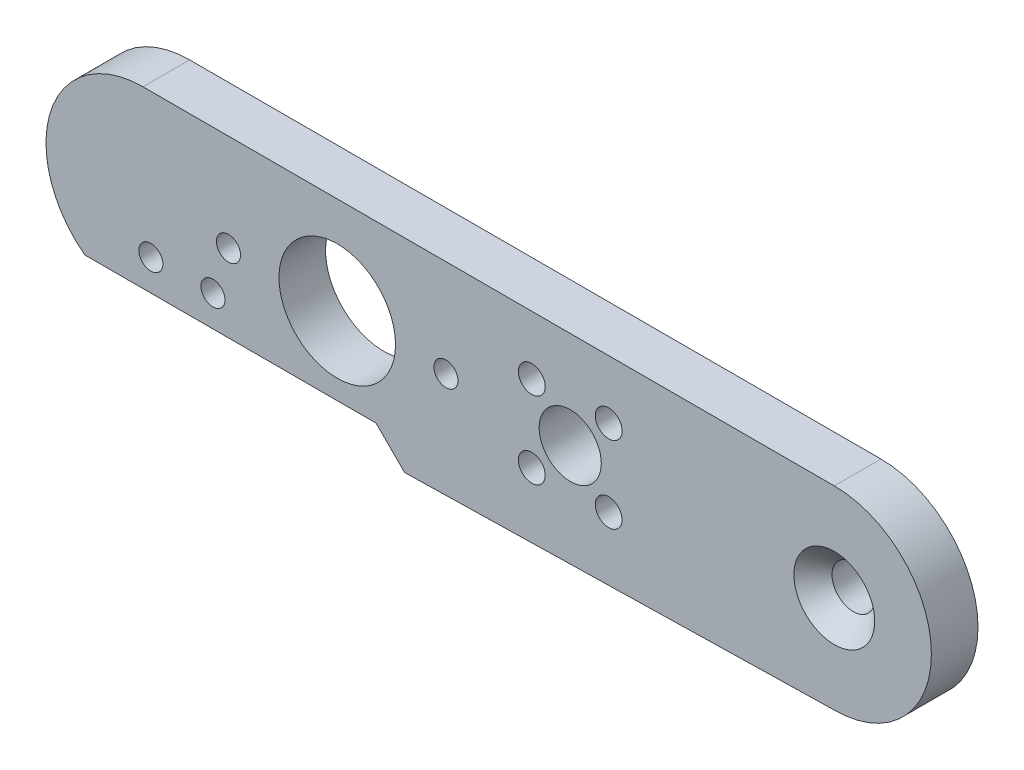
ISO-10303-21;
HEADER;
FILE_DESCRIPTION(('STEP AP214'),'2;1');
FILE_NAME('part.step','',(''),(''),'','','');
FILE_SCHEMA(('AUTOMOTIVE_DESIGN { 1 0 10303 214 1 1 1 1 }'));
ENDSEC;
DATA;
#1=APPLICATION_CONTEXT('core data for automotive mechanical design processes');
#2=APPLICATION_PROTOCOL_DEFINITION('international standard','automotive_design',2000,#1);
#3=PRODUCT_CONTEXT('',#1,'mechanical');
#4=PRODUCT('Part','Part','',(#3));
#5=PRODUCT_RELATED_PRODUCT_CATEGORY('part','',(#4));
#6=PRODUCT_DEFINITION_FORMATION('','',#4);
#7=PRODUCT_DEFINITION_CONTEXT('part definition',#1,'design');
#8=PRODUCT_DEFINITION('design','',#6,#7);
#9=PRODUCT_DEFINITION_SHAPE('','',#8);
#10=(LENGTH_UNIT() NAMED_UNIT(*) SI_UNIT(.MILLI.,.METRE.));
#11=(NAMED_UNIT(*) PLANE_ANGLE_UNIT() SI_UNIT($,.RADIAN.));
#12=(NAMED_UNIT(*) SI_UNIT($,.STERADIAN.) SOLID_ANGLE_UNIT());
#13=UNCERTAINTY_MEASURE_WITH_UNIT(LENGTH_MEASURE(1.E-05),#10,'distance_accuracy_value','');
#14=(GEOMETRIC_REPRESENTATION_CONTEXT(3) GLOBAL_UNCERTAINTY_ASSIGNED_CONTEXT((#13)) GLOBAL_UNIT_ASSIGNED_CONTEXT((#10,
#11,#12)) REPRESENTATION_CONTEXT('',''));
#15=CARTESIAN_POINT('',(0.,0.,0.));
#16=DIRECTION('',(0.,0.,1.));
#17=DIRECTION('',(1.,0.,0.));
#18=AXIS2_PLACEMENT_3D('',#15,#16,#17);
#19=CARTESIAN_POINT('',(-44.5,0.,6.));
#20=DIRECTION('',(0.,0.,1.));
#21=DIRECTION('',(1.,0.,0.));
#22=AXIS2_PLACEMENT_3D('',#19,#20,#21);
#23=PLANE('',#22);
#24=CARTESIAN_POINT('',(-43.5,-5.99999999999997,6.));
#25=DIRECTION('',(0.,0.,1.));
#26=DIRECTION('',(1.,0.,0.));
#27=AXIS2_PLACEMENT_3D('',#24,#25,#26);
#28=CIRCLE('',#27,1.55);
#29=CARTESIAN_POINT('',(-41.95,-5.99999999999997,6.));
#30=VERTEX_POINT('',#29);
#31=EDGE_CURVE('E251',#30,#30,#28,.T.);
#32=ORIENTED_EDGE('',*,*,#31,.F.);
#33=EDGE_LOOP('',(#32));
#34=FACE_BOUND('',#33,.T.);
#35=CARTESIAN_POINT('',(-35.5,-5.99999999999997,6.));
#36=DIRECTION('',(0.,0.,1.));
#37=DIRECTION('',(1.,0.,0.));
#38=AXIS2_PLACEMENT_3D('',#35,#36,#37);
#39=CIRCLE('',#38,1.55);
#40=CARTESIAN_POINT('',(-33.95,-5.99999999999997,6.));
#41=VERTEX_POINT('',#40);
#42=EDGE_CURVE('E255',#41,#41,#39,.T.);
#43=ORIENTED_EDGE('',*,*,#42,.F.);
#44=EDGE_LOOP('',(#43));
#45=FACE_BOUND('',#44,.T.);
#46=CARTESIAN_POINT('',(44.5,0.,6.));
#47=DIRECTION('',(0.,0.,1.));
#48=DIRECTION('',(1.,0.,0.));
#49=AXIS2_PLACEMENT_3D('',#46,#47,#48);
#50=CIRCLE('',#49,5.2);
#51=CARTESIAN_POINT('',(49.7,0.,6.));
#52=VERTEX_POINT('',#51);
#53=EDGE_CURVE('E261',#52,#52,#50,.T.);
#54=ORIENTED_EDGE('',*,*,#53,.F.);
#55=EDGE_LOOP('',(#54));
#56=FACE_BOUND('',#55,.T.);
#57=CARTESIAN_POINT('',(-5.5,0.,6.));
#58=DIRECTION('',(0.,0.,1.));
#59=DIRECTION('',(1.,0.,0.));
#60=AXIS2_PLACEMENT_3D('',#57,#58,#59);
#61=CIRCLE('',#60,1.55);
#62=CARTESIAN_POINT('',(-3.95,0.,6.));
#63=VERTEX_POINT('',#62);
#64=EDGE_CURVE('E277',#63,#63,#61,.T.);
#65=ORIENTED_EDGE('',*,*,#64,.F.);
#66=EDGE_LOOP('',(#65));
#67=FACE_BOUND('',#66,.T.);
#68=CARTESIAN_POINT('',(15.4497474683058,-4.94974746830584,6.));
#69=DIRECTION('',(0.,0.,1.));
#70=DIRECTION('',(-1.,0.,0.));
#71=AXIS2_PLACEMENT_3D('',#68,#69,#70);
#72=CIRCLE('',#71,1.72644884283377);
#73=CARTESIAN_POINT('',(13.723298625472,-4.94974746830584,6.));
#74=VERTEX_POINT('',#73);
#75=EDGE_CURVE('E289',#74,#74,#72,.T.);
#76=ORIENTED_EDGE('',*,*,#75,.F.);
#77=EDGE_LOOP('',(#76));
#78=FACE_BOUND('',#77,.T.);
#79=CARTESIAN_POINT('',(5.55025253169418,4.94974746830584,6.));
#80=DIRECTION('',(0.,0.,1.));
#81=DIRECTION('',(-1.,0.,0.));
#82=AXIS2_PLACEMENT_3D('',#79,#80,#81);
#83=CIRCLE('',#82,1.72644884283377);
#84=CARTESIAN_POINT('',(3.82380368886041,4.94974746830584,6.));
#85=VERTEX_POINT('',#84);
#86=EDGE_CURVE('E301',#85,#85,#83,.T.);
#87=ORIENTED_EDGE('',*,*,#86,.F.);
#88=EDGE_LOOP('',(#87));
#89=FACE_BOUND('',#88,.T.);
#90=CARTESIAN_POINT('',(10.5,0.,6.));
#91=DIRECTION('',(0.,0.,1.));
#92=DIRECTION('',(1.,0.,0.));
#93=AXIS2_PLACEMENT_3D('',#90,#91,#92);
#94=CIRCLE('',#93,4.);
#95=CARTESIAN_POINT('',(14.5,0.,6.));
#96=VERTEX_POINT('',#95);
#97=EDGE_CURVE('E121',#96,#96,#94,.T.);
#98=ORIENTED_EDGE('',*,*,#97,.F.);
#99=EDGE_LOOP('',(#98));
#100=FACE_BOUND('',#99,.T.);
#101=CARTESIAN_POINT('',(-44.5,0.,6.));
#102=DIRECTION('',(0.,0.,1.));
#103=DIRECTION('',(1.,0.,0.));
#104=AXIS2_PLACEMENT_3D('',#101,#102,#103);
#105=CIRCLE('',#104,12.5);
#106=CARTESIAN_POINT('',(-44.5,12.5,6.));
#107=VERTEX_POINT('',#106);
#108=CARTESIAN_POINT('',(-52.,-10.,6.));
#109=VERTEX_POINT('',#108);
#110=EDGE_CURVE('E128',#107,#109,#105,.T.);
#111=ORIENTED_EDGE('',*,*,#110,.T.);
#112=DIRECTION('',(1.,0.,0.));
#113=VECTOR('',#112,1.);
#114=CARTESIAN_POINT('',(-52.,-10.,6.));
#115=LINE('',#114,#113);
#116=CARTESIAN_POINT('',(-14.5,-10.,6.));
#117=VERTEX_POINT('',#116);
#118=EDGE_CURVE('E86',#109,#117,#115,.T.);
#119=ORIENTED_EDGE('',*,*,#118,.T.);
#120=DIRECTION('',(0.707106781186547,-0.707106781186549,0.));
#121=VECTOR('',#120,1.);
#122=CARTESIAN_POINT('',(-14.5,-10.,6.));
#123=LINE('',#122,#121);
#124=CARTESIAN_POINT('',(-10.829485488719,-13.670514511281,6.));
#125=VERTEX_POINT('',#124);
#126=EDGE_CURVE('E99',#117,#125,#123,.T.);
#127=ORIENTED_EDGE('',*,*,#126,.T.);
#128=DIRECTION('',(0.999776300713351,0.0211506154030379,0.));
#129=VECTOR('',#128,1.);
#130=CARTESIAN_POINT('',(-10.829485488719,-13.670514511281,6.));
#131=LINE('',#130,#129);
#132=CARTESIAN_POINT('',(44.5,-12.5,6.));
#133=VERTEX_POINT('',#132);
#134=EDGE_CURVE('E93',#125,#133,#131,.T.);
#135=ORIENTED_EDGE('',*,*,#134,.T.);
#136=CARTESIAN_POINT('',(44.5,0.,6.));
#137=DIRECTION('',(0.,0.,1.));
#138=DIRECTION('',(1.,0.,0.));
#139=AXIS2_PLACEMENT_3D('',#136,#137,#138);
#140=CIRCLE('',#139,12.5);
#141=CARTESIAN_POINT('',(44.5,12.5,6.));
#142=VERTEX_POINT('',#141);
#143=EDGE_CURVE('E97',#133,#142,#140,.T.);
#144=ORIENTED_EDGE('',*,*,#143,.T.);
#145=DIRECTION('',(-1.,0.,0.));
#146=VECTOR('',#145,1.);
#147=CARTESIAN_POINT('',(-44.5,12.5,6.));
#148=LINE('',#147,#146);
#149=EDGE_CURVE('E49',#142,#107,#148,.T.);
#150=ORIENTED_EDGE('',*,*,#149,.T.);
#151=EDGE_LOOP('',(#111,#119,#127,#135,#144,#150));
#152=FACE_BOUND('',#151,.T.);
#153=CARTESIAN_POINT('',(15.4497474683058,4.94974746830584,6.));
#154=DIRECTION('',(0.,0.,1.));
#155=DIRECTION('',(1.,0.,0.));
#156=AXIS2_PLACEMENT_3D('',#153,#154,#155);
#157=CIRCLE('',#156,1.72644884283376);
#158=CARTESIAN_POINT('',(17.1761963111396,4.94974746830584,6.));
#159=VERTEX_POINT('',#158);
#160=EDGE_CURVE('E307',#159,#159,#157,.T.);
#161=ORIENTED_EDGE('',*,*,#160,.F.);
#162=EDGE_LOOP('',(#161));
#163=FACE_BOUND('',#162,.T.);
#164=CARTESIAN_POINT('',(5.55025253169418,-4.94974746830584,6.));
#165=DIRECTION('',(0.,0.,1.));
#166=DIRECTION('',(1.,0.,0.));
#167=AXIS2_PLACEMENT_3D('',#164,#165,#166);
#168=CIRCLE('',#167,1.72644884283377);
#169=CARTESIAN_POINT('',(7.27670137452794,-4.94974746830584,6.));
#170=VERTEX_POINT('',#169);
#171=EDGE_CURVE('E295',#170,#170,#168,.T.);
#172=ORIENTED_EDGE('',*,*,#171,.F.);
#173=EDGE_LOOP('',(#172));
#174=FACE_BOUND('',#173,.T.);
#175=CARTESIAN_POINT('',(-19.5,0.,6.));
#176=DIRECTION('',(0.,0.,1.));
#177=DIRECTION('',(1.,0.,0.));
#178=AXIS2_PLACEMENT_3D('',#175,#176,#177);
#179=CIRCLE('',#178,7.5);
#180=CARTESIAN_POINT('',(-12.,0.,6.));
#181=VERTEX_POINT('',#180);
#182=EDGE_CURVE('E283',#181,#181,#179,.T.);
#183=ORIENTED_EDGE('',*,*,#182,.F.);
#184=EDGE_LOOP('',(#183));
#185=FACE_BOUND('',#184,.T.);
#186=CARTESIAN_POINT('',(-33.5,0.,6.));
#187=DIRECTION('',(0.,0.,1.));
#188=DIRECTION('',(1.,0.,0.));
#189=AXIS2_PLACEMENT_3D('',#186,#187,#188);
#190=CIRCLE('',#189,1.55);
#191=CARTESIAN_POINT('',(-31.95,0.,6.));
#192=VERTEX_POINT('',#191);
#193=EDGE_CURVE('E271',#192,#192,#190,.T.);
#194=ORIENTED_EDGE('',*,*,#193,.F.);
#195=EDGE_LOOP('',(#194));
#196=FACE_BOUND('',#195,.T.);
#197=ADVANCED_FACE('F32',(#34,#45,#56,#67,#78,#89,#100,#152,#163,#174,#185,#196),#23,.T.);
#198=CARTESIAN_POINT('',(-44.5,0.,0.));
#199=DIRECTION('',(0.,0.,1.));
#200=DIRECTION('',(1.,0.,0.));
#201=AXIS2_PLACEMENT_3D('',#198,#199,#200);
#202=PLANE('',#201);
#203=CARTESIAN_POINT('',(-35.5,-5.99999999999997,0.));
#204=DIRECTION('',(0.,0.,1.));
#205=DIRECTION('',(1.,0.,0.));
#206=AXIS2_PLACEMENT_3D('',#203,#204,#205);
#207=CIRCLE('',#206,3.);
#208=CARTESIAN_POINT('',(-32.5,-5.99999999999997,0.));
#209=VERTEX_POINT('',#208);
#210=EDGE_CURVE('E237',#209,#209,#207,.T.);
#211=ORIENTED_EDGE('',*,*,#210,.T.);
#212=EDGE_LOOP('',(#211));
#213=FACE_BOUND('',#212,.T.);
#214=CARTESIAN_POINT('',(-43.5,-5.99999999999997,0.));
#215=DIRECTION('',(0.,0.,1.));
#216=DIRECTION('',(1.,0.,0.));
#217=AXIS2_PLACEMENT_3D('',#214,#215,#216);
#218=CIRCLE('',#217,3.);
#219=CARTESIAN_POINT('',(-40.5,-5.99999999999997,0.));
#220=VERTEX_POINT('',#219);
#221=EDGE_CURVE('E238',#220,#220,#218,.T.);
#222=ORIENTED_EDGE('',*,*,#221,.T.);
#223=EDGE_LOOP('',(#222));
#224=FACE_BOUND('',#223,.T.);
#225=CARTESIAN_POINT('',(44.5,0.,0.));
#226=DIRECTION('',(0.,0.,1.));
#227=DIRECTION('',(1.,0.,0.));
#228=AXIS2_PLACEMENT_3D('',#225,#226,#227);
#229=CIRCLE('',#228,2.925);
#230=CARTESIAN_POINT('',(47.425,0.,0.));
#231=VERTEX_POINT('',#230);
#232=EDGE_CURVE('E254',#231,#231,#229,.T.);
#233=ORIENTED_EDGE('',*,*,#232,.T.);
#234=EDGE_LOOP('',(#233));
#235=FACE_BOUND('',#234,.T.);
#236=CARTESIAN_POINT('',(-44.5,0.,0.));
#237=DIRECTION('',(0.,0.,1.));
#238=DIRECTION('',(1.,0.,0.));
#239=AXIS2_PLACEMENT_3D('',#236,#237,#238);
#240=CIRCLE('',#239,12.5);
#241=CARTESIAN_POINT('',(-44.5,12.5,0.));
#242=VERTEX_POINT('',#241);
#243=CARTESIAN_POINT('',(-52.,-10.,0.));
#244=VERTEX_POINT('',#243);
#245=EDGE_CURVE('E117',#242,#244,#240,.T.);
#246=ORIENTED_EDGE('',*,*,#245,.F.);
#247=DIRECTION('',(-1.,0.,0.));
#248=VECTOR('',#247,1.);
#249=CARTESIAN_POINT('',(-44.5,12.5,0.));
#250=LINE('',#249,#248);
#251=CARTESIAN_POINT('',(44.5,12.5,0.));
#252=VERTEX_POINT('',#251);
#253=EDGE_CURVE('E78',#252,#242,#250,.T.);
#254=ORIENTED_EDGE('',*,*,#253,.F.);
#255=CARTESIAN_POINT('',(44.5,0.,0.));
#256=DIRECTION('',(0.,0.,1.));
#257=DIRECTION('',(1.,0.,0.));
#258=AXIS2_PLACEMENT_3D('',#255,#256,#257);
#259=CIRCLE('',#258,12.5);
#260=CARTESIAN_POINT('',(44.5,-12.5,0.));
#261=VERTEX_POINT('',#260);
#262=EDGE_CURVE('E72',#261,#252,#259,.T.);
#263=ORIENTED_EDGE('',*,*,#262,.F.);
#264=DIRECTION('',(0.999776300713351,0.0211506154030379,0.));
#265=VECTOR('',#264,1.);
#266=CARTESIAN_POINT('',(-10.829485488719,-13.670514511281,0.));
#267=LINE('',#266,#265);
#268=CARTESIAN_POINT('',(-10.829485488719,-13.670514511281,0.));
#269=VERTEX_POINT('',#268);
#270=EDGE_CURVE('E107',#269,#261,#267,.T.);
#271=ORIENTED_EDGE('',*,*,#270,.F.);
#272=DIRECTION('',(0.707106781186547,-0.707106781186549,0.));
#273=VECTOR('',#272,1.);
#274=CARTESIAN_POINT('',(-14.5,-10.,0.));
#275=LINE('',#274,#273);
#276=CARTESIAN_POINT('',(-14.5,-10.,0.));
#277=VERTEX_POINT('',#276);
#278=EDGE_CURVE('E123',#277,#269,#275,.T.);
#279=ORIENTED_EDGE('',*,*,#278,.F.);
#280=DIRECTION('',(1.,0.,0.));
#281=VECTOR('',#280,1.);
#282=CARTESIAN_POINT('',(-52.,-10.,0.));
#283=LINE('',#282,#281);
#284=EDGE_CURVE('E120',#244,#277,#283,.T.);
#285=ORIENTED_EDGE('',*,*,#284,.F.);
#286=EDGE_LOOP('',(#246,#254,#263,#271,#279,#285));
#287=FACE_BOUND('',#286,.T.);
#288=CARTESIAN_POINT('',(10.5,0.,0.));
#289=DIRECTION('',(0.,0.,1.));
#290=DIRECTION('',(1.,0.,0.));
#291=AXIS2_PLACEMENT_3D('',#288,#289,#290);
#292=CIRCLE('',#291,4.);
#293=CARTESIAN_POINT('',(14.5,0.,0.));
#294=VERTEX_POINT('',#293);
#295=EDGE_CURVE('E310',#294,#294,#292,.T.);
#296=ORIENTED_EDGE('',*,*,#295,.T.);
#297=EDGE_LOOP('',(#296));
#298=FACE_BOUND('',#297,.T.);
#299=CARTESIAN_POINT('',(15.4497474683058,4.94974746830584,0.));
#300=DIRECTION('',(0.,0.,1.));
#301=DIRECTION('',(1.,0.,0.));
#302=AXIS2_PLACEMENT_3D('',#299,#300,#301);
#303=CIRCLE('',#302,1.72644884283376);
#304=CARTESIAN_POINT('',(17.1761963111396,4.94974746830584,0.));
#305=VERTEX_POINT('',#304);
#306=EDGE_CURVE('E304',#305,#305,#303,.T.);
#307=ORIENTED_EDGE('',*,*,#306,.T.);
#308=EDGE_LOOP('',(#307));
#309=FACE_BOUND('',#308,.T.);
#310=CARTESIAN_POINT('',(5.55025253169418,4.94974746830584,0.));
#311=DIRECTION('',(0.,0.,1.));
#312=DIRECTION('',(-1.,0.,0.));
#313=AXIS2_PLACEMENT_3D('',#310,#311,#312);
#314=CIRCLE('',#313,1.72644884283377);
#315=CARTESIAN_POINT('',(3.82380368886041,4.94974746830584,0.));
#316=VERTEX_POINT('',#315);
#317=EDGE_CURVE('E298',#316,#316,#314,.T.);
#318=ORIENTED_EDGE('',*,*,#317,.T.);
#319=EDGE_LOOP('',(#318));
#320=FACE_BOUND('',#319,.T.);
#321=CARTESIAN_POINT('',(5.55025253169418,-4.94974746830584,0.));
#322=DIRECTION('',(0.,0.,1.));
#323=DIRECTION('',(1.,0.,0.));
#324=AXIS2_PLACEMENT_3D('',#321,#322,#323);
#325=CIRCLE('',#324,1.72644884283377);
#326=CARTESIAN_POINT('',(7.27670137452794,-4.94974746830584,0.));
#327=VERTEX_POINT('',#326);
#328=EDGE_CURVE('E292',#327,#327,#325,.T.);
#329=ORIENTED_EDGE('',*,*,#328,.T.);
#330=EDGE_LOOP('',(#329));
#331=FACE_BOUND('',#330,.T.);
#332=CARTESIAN_POINT('',(15.4497474683058,-4.94974746830584,0.));
#333=DIRECTION('',(0.,0.,1.));
#334=DIRECTION('',(-1.,0.,0.));
#335=AXIS2_PLACEMENT_3D('',#332,#333,#334);
#336=CIRCLE('',#335,1.72644884283377);
#337=CARTESIAN_POINT('',(13.723298625472,-4.94974746830584,0.));
#338=VERTEX_POINT('',#337);
#339=EDGE_CURVE('E286',#338,#338,#336,.T.);
#340=ORIENTED_EDGE('',*,*,#339,.T.);
#341=EDGE_LOOP('',(#340));
#342=FACE_BOUND('',#341,.T.);
#343=CARTESIAN_POINT('',(-19.5,0.,0.));
#344=DIRECTION('',(0.,0.,1.));
#345=DIRECTION('',(1.,0.,0.));
#346=AXIS2_PLACEMENT_3D('',#343,#344,#345);
#347=CIRCLE('',#346,7.5);
#348=CARTESIAN_POINT('',(-12.,0.,0.));
#349=VERTEX_POINT('',#348);
#350=EDGE_CURVE('E280',#349,#349,#347,.T.);
#351=ORIENTED_EDGE('',*,*,#350,.T.);
#352=EDGE_LOOP('',(#351));
#353=FACE_BOUND('',#352,.T.);
#354=CARTESIAN_POINT('',(-5.5,0.,0.));
#355=DIRECTION('',(0.,0.,1.));
#356=DIRECTION('',(1.,0.,0.));
#357=AXIS2_PLACEMENT_3D('',#354,#355,#356);
#358=CIRCLE('',#357,1.55);
#359=CARTESIAN_POINT('',(-3.95,0.,0.));
#360=VERTEX_POINT('',#359);
#361=EDGE_CURVE('E274',#360,#360,#358,.T.);
#362=ORIENTED_EDGE('',*,*,#361,.T.);
#363=EDGE_LOOP('',(#362));
#364=FACE_BOUND('',#363,.T.);
#365=CARTESIAN_POINT('',(-33.5,0.,0.));
#366=DIRECTION('',(0.,0.,1.));
#367=DIRECTION('',(1.,0.,0.));
#368=AXIS2_PLACEMENT_3D('',#365,#366,#367);
#369=CIRCLE('',#368,1.55);
#370=CARTESIAN_POINT('',(-31.95,0.,0.));
#371=VERTEX_POINT('',#370);
#372=EDGE_CURVE('E270',#371,#371,#369,.T.);
#373=ORIENTED_EDGE('',*,*,#372,.T.);
#374=EDGE_LOOP('',(#373));
#375=FACE_BOUND('',#374,.T.);
#376=ADVANCED_FACE('F137',(#213,#224,#235,#287,#298,#309,#320,#331,#342,#353,#364,#375),#202,.F.);
#377=CARTESIAN_POINT('',(-44.5,0.,6.));
#378=DIRECTION('',(0.,0.,-1.));
#379=DIRECTION('',(-1.,0.,0.));
#380=AXIS2_PLACEMENT_3D('',#377,#378,#379);
#381=CYLINDRICAL_SURFACE('',#380,12.5);
#382=ORIENTED_EDGE('',*,*,#245,.T.);
#383=DIRECTION('',(0.,0.,-1.));
#384=VECTOR('',#383,1.);
#385=CARTESIAN_POINT('',(-52.,-10.,6.));
#386=LINE('',#385,#384);
#387=EDGE_CURVE('E11',#109,#244,#386,.T.);
#388=ORIENTED_EDGE('',*,*,#387,.F.);
#389=ORIENTED_EDGE('',*,*,#110,.F.);
#390=DIRECTION('',(0.,0.,-1.));
#391=VECTOR('',#390,1.);
#392=CARTESIAN_POINT('',(-44.5,12.5,6.));
#393=LINE('',#392,#391);
#394=EDGE_CURVE('E113',#107,#242,#393,.T.);
#395=ORIENTED_EDGE('',*,*,#394,.T.);
#396=EDGE_LOOP('',(#382,#388,#389,#395));
#397=FACE_BOUND('',#396,.T.);
#398=ADVANCED_FACE('F34',(#397),#381,.T.);
#399=CARTESIAN_POINT('',(-52.,-10.,6.));
#400=DIRECTION('',(0.,1.,0.));
#401=DIRECTION('',(0.,0.,1.));
#402=AXIS2_PLACEMENT_3D('',#399,#400,#401);
#403=PLANE('',#402);
#404=ORIENTED_EDGE('',*,*,#284,.T.);
#405=DIRECTION('',(0.,0.,-1.));
#406=VECTOR('',#405,1.);
#407=CARTESIAN_POINT('',(-14.5,-10.,6.));
#408=LINE('',#407,#406);
#409=EDGE_CURVE('E41',#117,#277,#408,.T.);
#410=ORIENTED_EDGE('',*,*,#409,.F.);
#411=ORIENTED_EDGE('',*,*,#118,.F.);
#412=ORIENTED_EDGE('',*,*,#387,.T.);
#413=EDGE_LOOP('',(#404,#410,#411,#412));
#414=FACE_BOUND('',#413,.T.);
#415=ADVANCED_FACE('F467',(#414),#403,.F.);
#416=CARTESIAN_POINT('',(-14.5,-10.,6.));
#417=DIRECTION('',(0.707106781186548,0.707106781186546,0.));
#418=DIRECTION('',(-0.707106781186547,0.707106781186549,0.));
#419=AXIS2_PLACEMENT_3D('',#416,#417,#418);
#420=PLANE('',#419);
#421=ORIENTED_EDGE('',*,*,#278,.T.);
#422=DIRECTION('',(0.,0.,-1.));
#423=VECTOR('',#422,1.);
#424=CARTESIAN_POINT('',(-10.829485488719,-13.670514511281,6.));
#425=LINE('',#424,#423);
#426=EDGE_CURVE('E108',#125,#269,#425,.T.);
#427=ORIENTED_EDGE('',*,*,#426,.F.);
#428=ORIENTED_EDGE('',*,*,#126,.F.);
#429=ORIENTED_EDGE('',*,*,#409,.T.);
#430=EDGE_LOOP('',(#421,#427,#428,#429));
#431=FACE_BOUND('',#430,.T.);
#432=ADVANCED_FACE('F134',(#431),#420,.F.);
#433=CARTESIAN_POINT('',(-10.829485488719,-13.670514511281,6.));
#434=DIRECTION('',(-0.0211506154030379,0.999776300713351,0.));
#435=DIRECTION('',(-0.999776300713351,-0.0211506154030379,0.));
#436=AXIS2_PLACEMENT_3D('',#433,#434,#435);
#437=PLANE('',#436);
#438=ORIENTED_EDGE('',*,*,#270,.T.);
#439=DIRECTION('',(0.,0.,-1.));
#440=VECTOR('',#439,1.);
#441=CARTESIAN_POINT('',(44.5,-12.5,6.));
#442=LINE('',#441,#440);
#443=EDGE_CURVE('E104',#133,#261,#442,.T.);
#444=ORIENTED_EDGE('',*,*,#443,.F.);
#445=ORIENTED_EDGE('',*,*,#134,.F.);
#446=ORIENTED_EDGE('',*,*,#426,.T.);
#447=EDGE_LOOP('',(#438,#444,#445,#446));
#448=FACE_BOUND('',#447,.T.);
#449=ADVANCED_FACE('F105',(#448),#437,.F.);
#450=CARTESIAN_POINT('',(44.5,0.,6.));
#451=DIRECTION('',(0.,0.,-1.));
#452=DIRECTION('',(-1.,0.,0.));
#453=AXIS2_PLACEMENT_3D('',#450,#451,#452);
#454=CYLINDRICAL_SURFACE('',#453,12.5);
#455=ORIENTED_EDGE('',*,*,#262,.T.);
#456=DIRECTION('',(0.,0.,-1.));
#457=VECTOR('',#456,1.);
#458=CARTESIAN_POINT('',(44.5,12.5,6.));
#459=LINE('',#458,#457);
#460=EDGE_CURVE('E109',#142,#252,#459,.T.);
#461=ORIENTED_EDGE('',*,*,#460,.F.);
#462=ORIENTED_EDGE('',*,*,#143,.F.);
#463=ORIENTED_EDGE('',*,*,#443,.T.);
#464=EDGE_LOOP('',(#455,#461,#462,#463));
#465=FACE_BOUND('',#464,.T.);
#466=ADVANCED_FACE('F111',(#465),#454,.T.);
#467=CARTESIAN_POINT('',(-44.5,12.5,6.));
#468=DIRECTION('',(0.,-1.,0.));
#469=DIRECTION('',(1.,0.,0.));
#470=AXIS2_PLACEMENT_3D('',#467,#468,#469);
#471=PLANE('',#470);
#472=ORIENTED_EDGE('',*,*,#253,.T.);
#473=ORIENTED_EDGE('',*,*,#394,.F.);
#474=ORIENTED_EDGE('',*,*,#149,.F.);
#475=ORIENTED_EDGE('',*,*,#460,.T.);
#476=EDGE_LOOP('',(#472,#473,#474,#475));
#477=FACE_BOUND('',#476,.T.);
#478=ADVANCED_FACE('F142',(#477),#471,.F.);
#479=CARTESIAN_POINT('',(10.5,0.,6.));
#480=DIRECTION('',(0.,0.,-1.));
#481=DIRECTION('',(-1.,0.,0.));
#482=AXIS2_PLACEMENT_3D('',#479,#480,#481);
#483=CYLINDRICAL_SURFACE('',#482,4.);
#484=ORIENTED_EDGE('',*,*,#97,.T.);
#485=EDGE_LOOP('',(#484));
#486=FACE_BOUND('',#485,.T.);
#487=ORIENTED_EDGE('',*,*,#295,.F.);
#488=EDGE_LOOP('',(#487));
#489=FACE_BOUND('',#488,.T.);
#490=ADVANCED_FACE('F144',(#486,#489),#483,.F.);
#491=CARTESIAN_POINT('',(15.4497474683058,4.94974746830584,6.));
#492=DIRECTION('',(0.,0.,-1.));
#493=DIRECTION('',(-1.,0.,0.));
#494=AXIS2_PLACEMENT_3D('',#491,#492,#493);
#495=CYLINDRICAL_SURFACE('',#494,1.72644884283376);
#496=ORIENTED_EDGE('',*,*,#160,.T.);
#497=EDGE_LOOP('',(#496));
#498=FACE_BOUND('',#497,.T.);
#499=ORIENTED_EDGE('',*,*,#306,.F.);
#500=EDGE_LOOP('',(#499));
#501=FACE_BOUND('',#500,.T.);
#502=ADVANCED_FACE('F150',(#498,#501),#495,.F.);
#503=CARTESIAN_POINT('',(5.55025253169418,4.94974746830584,6.));
#504=DIRECTION('',(0.,0.,-1.));
#505=DIRECTION('',(-1.,0.,0.));
#506=AXIS2_PLACEMENT_3D('',#503,#504,#505);
#507=CYLINDRICAL_SURFACE('',#506,1.72644884283377);
#508=ORIENTED_EDGE('',*,*,#86,.T.);
#509=EDGE_LOOP('',(#508));
#510=FACE_BOUND('',#509,.T.);
#511=ORIENTED_EDGE('',*,*,#317,.F.);
#512=EDGE_LOOP('',(#511));
#513=FACE_BOUND('',#512,.T.);
#514=ADVANCED_FACE('F167',(#510,#513),#507,.F.);
#515=CARTESIAN_POINT('',(5.55025253169418,-4.94974746830584,6.));
#516=DIRECTION('',(0.,0.,-1.));
#517=DIRECTION('',(-1.,0.,0.));
#518=AXIS2_PLACEMENT_3D('',#515,#516,#517);
#519=CYLINDRICAL_SURFACE('',#518,1.72644884283377);
#520=ORIENTED_EDGE('',*,*,#171,.T.);
#521=EDGE_LOOP('',(#520));
#522=FACE_BOUND('',#521,.T.);
#523=ORIENTED_EDGE('',*,*,#328,.F.);
#524=EDGE_LOOP('',(#523));
#525=FACE_BOUND('',#524,.T.);
#526=ADVANCED_FACE('F171',(#522,#525),#519,.F.);
#527=CARTESIAN_POINT('',(15.4497474683058,-4.94974746830584,6.));
#528=DIRECTION('',(0.,0.,-1.));
#529=DIRECTION('',(-1.,0.,0.));
#530=AXIS2_PLACEMENT_3D('',#527,#528,#529);
#531=CYLINDRICAL_SURFACE('',#530,1.72644884283377);
#532=ORIENTED_EDGE('',*,*,#75,.T.);
#533=EDGE_LOOP('',(#532));
#534=FACE_BOUND('',#533,.T.);
#535=ORIENTED_EDGE('',*,*,#339,.F.);
#536=EDGE_LOOP('',(#535));
#537=FACE_BOUND('',#536,.T.);
#538=ADVANCED_FACE('F175',(#534,#537),#531,.F.);
#539=CARTESIAN_POINT('',(-19.5,0.,6.));
#540=DIRECTION('',(0.,0.,-1.));
#541=DIRECTION('',(-1.,0.,0.));
#542=AXIS2_PLACEMENT_3D('',#539,#540,#541);
#543=CYLINDRICAL_SURFACE('',#542,7.5);
#544=ORIENTED_EDGE('',*,*,#182,.T.);
#545=EDGE_LOOP('',(#544));
#546=FACE_BOUND('',#545,.T.);
#547=ORIENTED_EDGE('',*,*,#350,.F.);
#548=EDGE_LOOP('',(#547));
#549=FACE_BOUND('',#548,.T.);
#550=ADVANCED_FACE('F179',(#546,#549),#543,.F.);
#551=CARTESIAN_POINT('',(-5.5,0.,6.));
#552=DIRECTION('',(0.,0.,-1.));
#553=DIRECTION('',(-1.,0.,0.));
#554=AXIS2_PLACEMENT_3D('',#551,#552,#553);
#555=CYLINDRICAL_SURFACE('',#554,1.55);
#556=ORIENTED_EDGE('',*,*,#64,.T.);
#557=EDGE_LOOP('',(#556));
#558=FACE_BOUND('',#557,.T.);
#559=ORIENTED_EDGE('',*,*,#361,.F.);
#560=EDGE_LOOP('',(#559));
#561=FACE_BOUND('',#560,.T.);
#562=ADVANCED_FACE('F183',(#558,#561),#555,.F.);
#563=CARTESIAN_POINT('',(-33.5,0.,6.));
#564=DIRECTION('',(0.,0.,-1.));
#565=DIRECTION('',(-1.,0.,0.));
#566=AXIS2_PLACEMENT_3D('',#563,#564,#565);
#567=CYLINDRICAL_SURFACE('',#566,1.55);
#568=ORIENTED_EDGE('',*,*,#193,.T.);
#569=EDGE_LOOP('',(#568));
#570=FACE_BOUND('',#569,.T.);
#571=ORIENTED_EDGE('',*,*,#372,.F.);
#572=EDGE_LOOP('',(#571));
#573=FACE_BOUND('',#572,.T.);
#574=ADVANCED_FACE('F187',(#570,#573),#567,.F.);
#575=CARTESIAN_POINT('',(44.5,0.,0.175000000000002));
#576=DIRECTION('',(0.,0.,-1.));
#577=DIRECTION('',(-1.,0.,0.));
#578=AXIS2_PLACEMENT_3D('',#575,#576,#577);
#579=CONICAL_SURFACE('',#578,2.75,0.785398163397433);
#580=ORIENTED_EDGE('',*,*,#232,.F.);
#581=EDGE_LOOP('',(#580));
#582=FACE_BOUND('',#581,.T.);
#583=CARTESIAN_POINT('',(44.5,0.,0.175000000000002));
#584=DIRECTION('',(0.,0.,1.));
#585=DIRECTION('',(1.,0.,0.));
#586=AXIS2_PLACEMENT_3D('',#583,#584,#585);
#587=CIRCLE('',#586,2.75);
#588=CARTESIAN_POINT('',(47.25,0.,0.175000000000002));
#589=VERTEX_POINT('',#588);
#590=EDGE_CURVE('E267',#589,#589,#587,.T.);
#591=ORIENTED_EDGE('',*,*,#590,.T.);
#592=EDGE_LOOP('',(#591));
#593=FACE_BOUND('',#592,.T.);
#594=ADVANCED_FACE('F191',(#582,#593),#579,.F.);
#595=CARTESIAN_POINT('',(44.5,0.,6.));
#596=DIRECTION('',(0.,0.,1.));
#597=DIRECTION('',(1.,0.,0.));
#598=AXIS2_PLACEMENT_3D('',#595,#596,#597);
#599=CYLINDRICAL_SURFACE('',#598,2.75);
#600=ORIENTED_EDGE('',*,*,#590,.F.);
#601=EDGE_LOOP('',(#600));
#602=FACE_BOUND('',#601,.T.);
#603=CARTESIAN_POINT('',(44.5,0.,3.55));
#604=DIRECTION('',(0.,0.,1.));
#605=DIRECTION('',(1.,0.,0.));
#606=AXIS2_PLACEMENT_3D('',#603,#604,#605);
#607=CIRCLE('',#606,2.75);
#608=CARTESIAN_POINT('',(47.25,0.,3.55));
#609=VERTEX_POINT('',#608);
#610=EDGE_CURVE('E264',#609,#609,#607,.T.);
#611=ORIENTED_EDGE('',*,*,#610,.T.);
#612=EDGE_LOOP('',(#611));
#613=FACE_BOUND('',#612,.T.);
#614=ADVANCED_FACE('F195',(#602,#613),#599,.F.);
#615=CARTESIAN_POINT('',(44.5,0.,6.));
#616=DIRECTION('',(0.,0.,1.));
#617=DIRECTION('',(1.,0.,0.));
#618=AXIS2_PLACEMENT_3D('',#615,#616,#617);
#619=CONICAL_SURFACE('',#618,5.2,0.785398163397447);
#620=ORIENTED_EDGE('',*,*,#610,.F.);
#621=EDGE_LOOP('',(#620));
#622=FACE_BOUND('',#621,.T.);
#623=ORIENTED_EDGE('',*,*,#53,.T.);
#624=EDGE_LOOP('',(#623));
#625=FACE_BOUND('',#624,.T.);
#626=ADVANCED_FACE('F199',(#622,#625),#619,.F.);
#627=CARTESIAN_POINT('',(-35.5,-5.99999999999997,3.));
#628=DIRECTION('',(0.,0.,1.));
#629=DIRECTION('',(1.,0.,0.));
#630=AXIS2_PLACEMENT_3D('',#627,#628,#629);
#631=CYLINDRICAL_SURFACE('',#630,1.55);
#632=CARTESIAN_POINT('',(-35.5,-5.99999999999997,3.));
#633=DIRECTION('',(0.,0.,1.));
#634=DIRECTION('',(1.,0.,0.));
#635=AXIS2_PLACEMENT_3D('',#632,#633,#634);
#636=CIRCLE('',#635,1.55);
#637=CARTESIAN_POINT('',(-33.95,-5.99999999999997,3.));
#638=VERTEX_POINT('',#637);
#639=EDGE_CURVE('E232',#638,#638,#636,.T.);
#640=ORIENTED_EDGE('',*,*,#639,.F.);
#641=EDGE_LOOP('',(#640));
#642=FACE_BOUND('',#641,.T.);
#643=ORIENTED_EDGE('',*,*,#42,.T.);
#644=EDGE_LOOP('',(#643));
#645=FACE_BOUND('',#644,.T.);
#646=ADVANCED_FACE('F203',(#642,#645),#631,.F.);
#647=CARTESIAN_POINT('',(-43.5,-5.99999999999997,3.));
#648=DIRECTION('',(0.,0.,1.));
#649=DIRECTION('',(1.,0.,0.));
#650=AXIS2_PLACEMENT_3D('',#647,#648,#649);
#651=CYLINDRICAL_SURFACE('',#650,1.55);
#652=CARTESIAN_POINT('',(-43.5,-5.99999999999997,3.));
#653=DIRECTION('',(0.,0.,1.));
#654=DIRECTION('',(1.,0.,0.));
#655=AXIS2_PLACEMENT_3D('',#652,#653,#654);
#656=CIRCLE('',#655,1.55);
#657=CARTESIAN_POINT('',(-41.95,-5.99999999999997,3.));
#658=VERTEX_POINT('',#657);
#659=EDGE_CURVE('E241',#658,#658,#656,.T.);
#660=ORIENTED_EDGE('',*,*,#659,.F.);
#661=EDGE_LOOP('',(#660));
#662=FACE_BOUND('',#661,.T.);
#663=ORIENTED_EDGE('',*,*,#31,.T.);
#664=EDGE_LOOP('',(#663));
#665=FACE_BOUND('',#664,.T.);
#666=ADVANCED_FACE('F207',(#662,#665),#651,.F.);
#667=CARTESIAN_POINT('',(-43.5,-5.99999999999997,0.));
#668=DIRECTION('',(0.,0.,1.));
#669=DIRECTION('',(1.,0.,0.));
#670=AXIS2_PLACEMENT_3D('',#667,#668,#669);
#671=CYLINDRICAL_SURFACE('',#670,3.);
#672=ORIENTED_EDGE('',*,*,#221,.F.);
#673=EDGE_LOOP('',(#672));
#674=FACE_BOUND('',#673,.T.);
#675=CARTESIAN_POINT('',(-43.5,-5.99999999999997,3.));
#676=DIRECTION('',(0.,0.,1.));
#677=DIRECTION('',(1.,0.,0.));
#678=AXIS2_PLACEMENT_3D('',#675,#676,#677);
#679=CIRCLE('',#678,3.);
#680=CARTESIAN_POINT('',(-40.5,-5.99999999999997,3.));
#681=VERTEX_POINT('',#680);
#682=EDGE_CURVE('E244',#681,#681,#679,.T.);
#683=ORIENTED_EDGE('',*,*,#682,.T.);
#684=EDGE_LOOP('',(#683));
#685=FACE_BOUND('',#684,.T.);
#686=ADVANCED_FACE('F211',(#674,#685),#671,.F.);
#687=CARTESIAN_POINT('',(-43.5,-5.99999999999997,3.));
#688=DIRECTION('',(0.,0.,1.));
#689=DIRECTION('',(1.,0.,0.));
#690=AXIS2_PLACEMENT_3D('',#687,#688,#689);
#691=PLANE('',#690);
#692=ORIENTED_EDGE('',*,*,#659,.T.);
#693=EDGE_LOOP('',(#692));
#694=FACE_BOUND('',#693,.T.);
#695=ORIENTED_EDGE('',*,*,#682,.F.);
#696=EDGE_LOOP('',(#695));
#697=FACE_BOUND('',#696,.T.);
#698=ADVANCED_FACE('F215',(#694,#697),#691,.F.);
#699=CARTESIAN_POINT('',(-35.5,-5.99999999999997,0.));
#700=DIRECTION('',(0.,0.,1.));
#701=DIRECTION('',(1.,0.,0.));
#702=AXIS2_PLACEMENT_3D('',#699,#700,#701);
#703=CYLINDRICAL_SURFACE('',#702,3.);
#704=ORIENTED_EDGE('',*,*,#210,.F.);
#705=EDGE_LOOP('',(#704));
#706=FACE_BOUND('',#705,.T.);
#707=CARTESIAN_POINT('',(-35.5,-5.99999999999997,3.));
#708=DIRECTION('',(0.,0.,1.));
#709=DIRECTION('',(1.,0.,0.));
#710=AXIS2_PLACEMENT_3D('',#707,#708,#709);
#711=CIRCLE('',#710,3.);
#712=CARTESIAN_POINT('',(-32.5,-5.99999999999997,3.));
#713=VERTEX_POINT('',#712);
#714=EDGE_CURVE('E235',#713,#713,#711,.T.);
#715=ORIENTED_EDGE('',*,*,#714,.T.);
#716=EDGE_LOOP('',(#715));
#717=FACE_BOUND('',#716,.T.);
#718=ADVANCED_FACE('F219',(#706,#717),#703,.F.);
#719=CARTESIAN_POINT('',(-35.5,-5.99999999999997,3.));
#720=DIRECTION('',(0.,0.,1.));
#721=DIRECTION('',(1.,0.,0.));
#722=AXIS2_PLACEMENT_3D('',#719,#720,#721);
#723=PLANE('',#722);
#724=ORIENTED_EDGE('',*,*,#639,.T.);
#725=EDGE_LOOP('',(#724));
#726=FACE_BOUND('',#725,.T.);
#727=ORIENTED_EDGE('',*,*,#714,.F.);
#728=EDGE_LOOP('',(#727));
#729=FACE_BOUND('',#728,.T.);
#730=ADVANCED_FACE('F223',(#726,#729),#723,.F.);
#731=CLOSED_SHELL('',(#197,#376,#398,#415,#432,#449,#466,#478,#490,#502,#514,#526,#538,#550,
#562,#574,#594,#614,#626,#646,#666,#686,#698,#718,#730));
#732=MANIFOLD_SOLID_BREP('B2',#731);
#733=ADVANCED_BREP_SHAPE_REPRESENTATION('',(#18,#732),#14);
#734=SHAPE_DEFINITION_REPRESENTATION(#9,#733);
ENDSEC;
END-ISO-10303-21;
